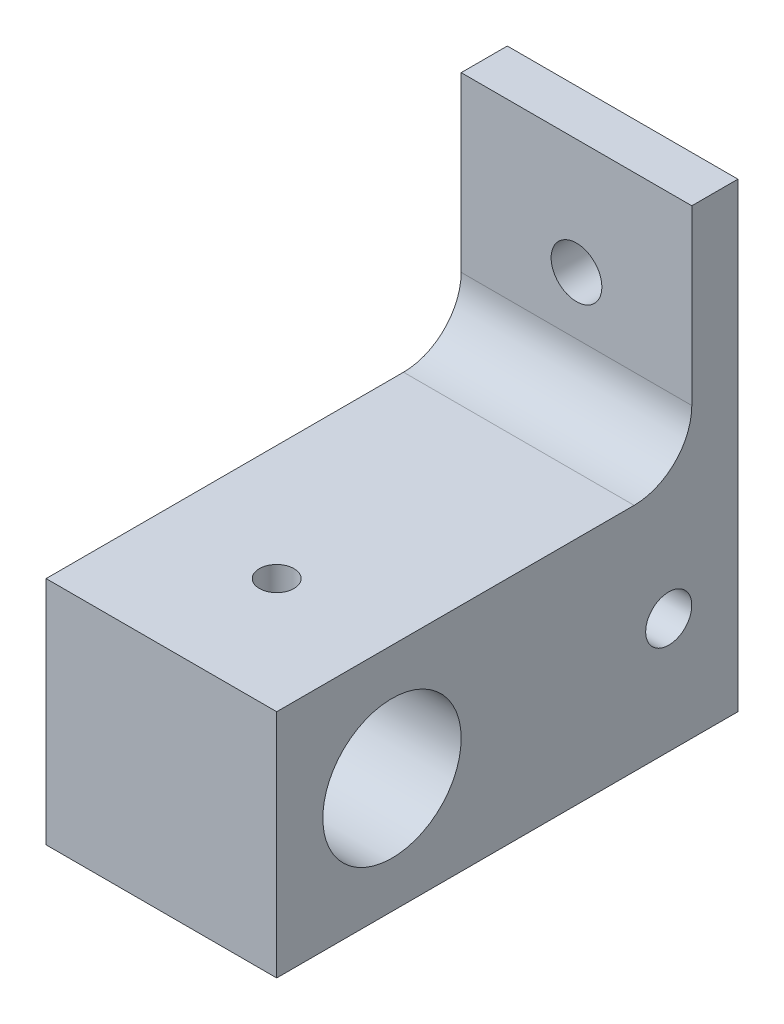
ISO-10303-21;
HEADER;
FILE_DESCRIPTION(('STEP AP214'),'2;1');
FILE_NAME('part.step','',(''),(''),'','','');
FILE_SCHEMA(('AUTOMOTIVE_DESIGN { 1 0 10303 214 1 1 1 1 }'));
ENDSEC;
DATA;
#1=APPLICATION_CONTEXT('core data for automotive mechanical design processes');
#2=APPLICATION_PROTOCOL_DEFINITION('international standard','automotive_design',2000,#1);
#3=PRODUCT_CONTEXT('',#1,'mechanical');
#4=PRODUCT('Part','Part','',(#3));
#5=PRODUCT_RELATED_PRODUCT_CATEGORY('part','',(#4));
#6=PRODUCT_DEFINITION_FORMATION('','',#4);
#7=PRODUCT_DEFINITION_CONTEXT('part definition',#1,'design');
#8=PRODUCT_DEFINITION('design','',#6,#7);
#9=PRODUCT_DEFINITION_SHAPE('','',#8);
#10=(LENGTH_UNIT() NAMED_UNIT(*) SI_UNIT(.MILLI.,.METRE.));
#11=(NAMED_UNIT(*) PLANE_ANGLE_UNIT() SI_UNIT($,.RADIAN.));
#12=(NAMED_UNIT(*) SI_UNIT($,.STERADIAN.) SOLID_ANGLE_UNIT());
#13=UNCERTAINTY_MEASURE_WITH_UNIT(LENGTH_MEASURE(1.E-05),#10,'distance_accuracy_value','');
#14=(GEOMETRIC_REPRESENTATION_CONTEXT(3) GLOBAL_UNCERTAINTY_ASSIGNED_CONTEXT((#13)) GLOBAL_UNIT_ASSIGNED_CONTEXT((#10,
#11,#12)) REPRESENTATION_CONTEXT('',''));
#15=CARTESIAN_POINT('',(0.,0.,0.));
#16=DIRECTION('',(0.,0.,1.));
#17=DIRECTION('',(1.,0.,0.));
#18=AXIS2_PLACEMENT_3D('',#15,#16,#17);
#19=CARTESIAN_POINT('',(0.,20.,40.));
#20=DIRECTION('',(0.,-1.,0.));
#21=DIRECTION('',(0.,0.,-1.));
#22=AXIS2_PLACEMENT_3D('',#19,#20,#21);
#23=PLANE('',#22);
#24=CARTESIAN_POINT('',(10.,20.,30.));
#25=DIRECTION('',(0.,1.,0.));
#26=DIRECTION('',(0.,0.,1.));
#27=AXIS2_PLACEMENT_3D('',#24,#25,#26);
#28=CIRCLE('',#27,1.5);
#29=CARTESIAN_POINT('',(10.,20.,31.5));
#30=VERTEX_POINT('',#29);
#31=EDGE_CURVE('E155',#30,#30,#28,.T.);
#32=ORIENTED_EDGE('',*,*,#31,.F.);
#33=EDGE_LOOP('',(#32));
#34=FACE_BOUND('',#33,.T.);
#35=DIRECTION('',(0.,0.,-1.));
#36=VECTOR('',#35,1.);
#37=CARTESIAN_POINT('',(20.,20.,40.));
#38=LINE('',#37,#36);
#39=CARTESIAN_POINT('',(20.,20.,40.));
#40=VERTEX_POINT('',#39);
#41=CARTESIAN_POINT('',(20.,20.,9.));
#42=VERTEX_POINT('',#41);
#43=EDGE_CURVE('E233',#40,#42,#38,.T.);
#44=ORIENTED_EDGE('',*,*,#43,.T.);
#45=DIRECTION('',(1.,0.,0.));
#46=VECTOR('',#45,1.);
#47=CARTESIAN_POINT('',(0.,20.,9.00000000000001));
#48=LINE('',#47,#46);
#49=CARTESIAN_POINT('',(0.,20.,9.00000000000001));
#50=VERTEX_POINT('',#49);
#51=EDGE_CURVE('E65',#42,#50,#48,.F.);
#52=ORIENTED_EDGE('',*,*,#51,.T.);
#53=DIRECTION('',(0.,0.,-1.));
#54=VECTOR('',#53,1.);
#55=CARTESIAN_POINT('',(0.,20.,40.));
#56=LINE('',#55,#54);
#57=CARTESIAN_POINT('',(0.,20.,40.));
#58=VERTEX_POINT('',#57);
#59=EDGE_CURVE('E230',#58,#50,#56,.T.);
#60=ORIENTED_EDGE('',*,*,#59,.F.);
#61=DIRECTION('',(-1.,0.,0.));
#62=VECTOR('',#61,1.);
#63=CARTESIAN_POINT('',(0.,20.,40.));
#64=LINE('',#63,#62);
#65=EDGE_CURVE('E234',#40,#58,#64,.T.);
#66=ORIENTED_EDGE('',*,*,#65,.F.);
#67=EDGE_LOOP('',(#44,#52,#60,#66));
#68=FACE_BOUND('',#67,.T.);
#69=ADVANCED_FACE('F43',(#34,#68),#23,.F.);
#70=CARTESIAN_POINT('',(0.,0.,40.));
#71=DIRECTION('',(1.,0.,0.));
#72=DIRECTION('',(0.,0.,-1.));
#73=AXIS2_PLACEMENT_3D('',#70,#71,#72);
#74=PLANE('',#73);
#75=CARTESIAN_POINT('',(0.,10.,6.));
#76=DIRECTION('',(-1.,0.,0.));
#77=DIRECTION('',(0.,0.,1.));
#78=AXIS2_PLACEMENT_3D('',#75,#76,#77);
#79=CIRCLE('',#78,2.);
#80=CARTESIAN_POINT('',(0.,10.,8.));
#81=VERTEX_POINT('',#80);
#82=EDGE_CURVE('E150',#81,#81,#79,.T.);
#83=ORIENTED_EDGE('',*,*,#82,.F.);
#84=EDGE_LOOP('',(#83));
#85=FACE_BOUND('',#84,.T.);
#86=CARTESIAN_POINT('',(0.,10.,30.));
#87=DIRECTION('',(1.,0.,0.));
#88=DIRECTION('',(0.,0.,-1.));
#89=AXIS2_PLACEMENT_3D('',#86,#87,#88);
#90=CIRCLE('',#89,6.);
#91=CARTESIAN_POINT('',(0.,10.,24.));
#92=VERTEX_POINT('',#91);
#93=EDGE_CURVE('E226',#92,#92,#90,.T.);
#94=ORIENTED_EDGE('',*,*,#93,.T.);
#95=EDGE_LOOP('',(#94));
#96=FACE_BOUND('',#95,.T.);
#97=DIRECTION('',(0.,-1.,0.));
#98=VECTOR('',#97,1.);
#99=CARTESIAN_POINT('',(0.,0.,0.));
#100=LINE('',#99,#98);
#101=CARTESIAN_POINT('',(0.,40.,0.));
#102=VERTEX_POINT('',#101);
#103=CARTESIAN_POINT('',(0.,0.,0.));
#104=VERTEX_POINT('',#103);
#105=EDGE_CURVE('E120',#102,#104,#100,.T.);
#106=ORIENTED_EDGE('',*,*,#105,.T.);
#107=DIRECTION('',(0.,0.,-1.));
#108=VECTOR('',#107,1.);
#109=CARTESIAN_POINT('',(0.,0.,40.));
#110=LINE('',#109,#108);
#111=CARTESIAN_POINT('',(0.,0.,40.));
#112=VERTEX_POINT('',#111);
#113=EDGE_CURVE('E222',#112,#104,#110,.T.);
#114=ORIENTED_EDGE('',*,*,#113,.F.);
#115=DIRECTION('',(0.,-1.,0.));
#116=VECTOR('',#115,1.);
#117=CARTESIAN_POINT('',(0.,0.,40.));
#118=LINE('',#117,#116);
#119=EDGE_CURVE('E113',#58,#112,#118,.T.);
#120=ORIENTED_EDGE('',*,*,#119,.F.);
#121=ORIENTED_EDGE('',*,*,#59,.T.);
#122=CARTESIAN_POINT('',(0.,25.,9.00000000000001));
#123=DIRECTION('',(1.,0.,0.));
#124=DIRECTION('',(0.,0.,-1.));
#125=AXIS2_PLACEMENT_3D('',#122,#123,#124);
#126=CIRCLE('',#125,5.);
#127=CARTESIAN_POINT('',(0.,25.,4.));
#128=VERTEX_POINT('',#127);
#129=EDGE_CURVE('E11',#50,#128,#126,.T.);
#130=ORIENTED_EDGE('',*,*,#129,.T.);
#131=DIRECTION('',(0.,-1.,0.));
#132=VECTOR('',#131,1.);
#133=CARTESIAN_POINT('',(0.,40.,4.));
#134=LINE('',#133,#132);
#135=CARTESIAN_POINT('',(0.,40.,4.));
#136=VERTEX_POINT('',#135);
#137=EDGE_CURVE('E146',#136,#128,#134,.T.);
#138=ORIENTED_EDGE('',*,*,#137,.F.);
#139=DIRECTION('',(0.,0.,1.));
#140=VECTOR('',#139,1.);
#141=CARTESIAN_POINT('',(0.,40.,0.));
#142=LINE('',#141,#140);
#143=EDGE_CURVE('E124',#102,#136,#142,.T.);
#144=ORIENTED_EDGE('',*,*,#143,.F.);
#145=EDGE_LOOP('',(#106,#114,#120,#121,#130,#138,#144));
#146=FACE_BOUND('',#145,.T.);
#147=ADVANCED_FACE('F198',(#85,#96,#146),#74,.F.);
#148=CARTESIAN_POINT('',(0.,0.,40.));
#149=DIRECTION('',(0.,1.,0.));
#150=DIRECTION('',(0.,0.,1.));
#151=AXIS2_PLACEMENT_3D('',#148,#149,#150);
#152=PLANE('',#151);
#153=DIRECTION('',(1.,0.,0.));
#154=VECTOR('',#153,1.);
#155=CARTESIAN_POINT('',(0.,0.,0.));
#156=LINE('',#155,#154);
#157=CARTESIAN_POINT('',(20.,0.,0.));
#158=VERTEX_POINT('',#157);
#159=EDGE_CURVE('E114',#104,#158,#156,.T.);
#160=ORIENTED_EDGE('',*,*,#159,.T.);
#161=DIRECTION('',(0.,0.,-1.));
#162=VECTOR('',#161,1.);
#163=CARTESIAN_POINT('',(20.,0.,40.));
#164=LINE('',#163,#162);
#165=CARTESIAN_POINT('',(20.,0.,40.));
#166=VERTEX_POINT('',#165);
#167=EDGE_CURVE('E110',#166,#158,#164,.T.);
#168=ORIENTED_EDGE('',*,*,#167,.F.);
#169=DIRECTION('',(1.,0.,0.));
#170=VECTOR('',#169,1.);
#171=CARTESIAN_POINT('',(0.,0.,40.));
#172=LINE('',#171,#170);
#173=EDGE_CURVE('E254',#112,#166,#172,.T.);
#174=ORIENTED_EDGE('',*,*,#173,.F.);
#175=ORIENTED_EDGE('',*,*,#113,.T.);
#176=EDGE_LOOP('',(#160,#168,#174,#175));
#177=FACE_BOUND('',#176,.T.);
#178=ADVANCED_FACE('F205',(#177),#152,.F.);
#179=CARTESIAN_POINT('',(20.,0.,40.));
#180=DIRECTION('',(-1.,0.,0.));
#181=DIRECTION('',(0.,0.,1.));
#182=AXIS2_PLACEMENT_3D('',#179,#180,#181);
#183=PLANE('',#182);
#184=CARTESIAN_POINT('',(20.,10.,6.));
#185=DIRECTION('',(-1.,0.,0.));
#186=DIRECTION('',(0.,0.,1.));
#187=AXIS2_PLACEMENT_3D('',#184,#185,#186);
#188=CIRCLE('',#187,2.);
#189=CARTESIAN_POINT('',(20.,10.,8.));
#190=VERTEX_POINT('',#189);
#191=EDGE_CURVE('E154',#190,#190,#188,.T.);
#192=ORIENTED_EDGE('',*,*,#191,.T.);
#193=EDGE_LOOP('',(#192));
#194=FACE_BOUND('',#193,.T.);
#195=CARTESIAN_POINT('',(20.,10.,30.));
#196=DIRECTION('',(1.,0.,0.));
#197=DIRECTION('',(0.,0.,-1.));
#198=AXIS2_PLACEMENT_3D('',#195,#196,#197);
#199=CIRCLE('',#198,6.);
#200=CARTESIAN_POINT('',(20.,10.,24.));
#201=VERTEX_POINT('',#200);
#202=EDGE_CURVE('E168',#201,#201,#199,.T.);
#203=ORIENTED_EDGE('',*,*,#202,.F.);
#204=EDGE_LOOP('',(#203));
#205=FACE_BOUND('',#204,.T.);
#206=DIRECTION('',(0.,1.,0.));
#207=VECTOR('',#206,1.);
#208=CARTESIAN_POINT('',(20.,0.,0.));
#209=LINE('',#208,#207);
#210=CARTESIAN_POINT('',(20.,40.,0.));
#211=VERTEX_POINT('',#210);
#212=EDGE_CURVE('E103',#158,#211,#209,.T.);
#213=ORIENTED_EDGE('',*,*,#212,.T.);
#214=DIRECTION('',(0.,0.,-1.));
#215=VECTOR('',#214,1.);
#216=CARTESIAN_POINT('',(20.,40.,0.));
#217=LINE('',#216,#215);
#218=CARTESIAN_POINT('',(20.,40.,4.));
#219=VERTEX_POINT('',#218);
#220=EDGE_CURVE('E107',#219,#211,#217,.T.);
#221=ORIENTED_EDGE('',*,*,#220,.F.);
#222=DIRECTION('',(0.,-1.,0.));
#223=VECTOR('',#222,1.);
#224=CARTESIAN_POINT('',(20.,40.,4.));
#225=LINE('',#224,#223);
#226=CARTESIAN_POINT('',(20.,25.,4.));
#227=VERTEX_POINT('',#226);
#228=EDGE_CURVE('E143',#219,#227,#225,.T.);
#229=ORIENTED_EDGE('',*,*,#228,.T.);
#230=CARTESIAN_POINT('',(20.,25.,9.));
#231=DIRECTION('',(-1.,0.,0.));
#232=DIRECTION('',(0.,0.,1.));
#233=AXIS2_PLACEMENT_3D('',#230,#231,#232);
#234=CIRCLE('',#233,5.);
#235=EDGE_CURVE('E52',#227,#42,#234,.T.);
#236=ORIENTED_EDGE('',*,*,#235,.T.);
#237=ORIENTED_EDGE('',*,*,#43,.F.);
#238=DIRECTION('',(0.,1.,0.));
#239=VECTOR('',#238,1.);
#240=CARTESIAN_POINT('',(20.,0.,40.));
#241=LINE('',#240,#239);
#242=EDGE_CURVE('E252',#166,#40,#241,.T.);
#243=ORIENTED_EDGE('',*,*,#242,.F.);
#244=ORIENTED_EDGE('',*,*,#167,.T.);
#245=EDGE_LOOP('',(#213,#221,#229,#236,#237,#243,#244));
#246=FACE_BOUND('',#245,.T.);
#247=ADVANCED_FACE('F105',(#194,#205,#246),#183,.F.);
#248=CARTESIAN_POINT('',(0.,0.,40.));
#249=DIRECTION('',(0.,0.,-1.));
#250=DIRECTION('',(-1.,0.,0.));
#251=AXIS2_PLACEMENT_3D('',#248,#249,#250);
#252=PLANE('',#251);
#253=ORIENTED_EDGE('',*,*,#119,.T.);
#254=ORIENTED_EDGE('',*,*,#173,.T.);
#255=ORIENTED_EDGE('',*,*,#242,.T.);
#256=ORIENTED_EDGE('',*,*,#65,.T.);
#257=EDGE_LOOP('',(#253,#254,#255,#256));
#258=FACE_BOUND('',#257,.T.);
#259=ADVANCED_FACE('F213',(#258),#252,.F.);
#260=CARTESIAN_POINT('',(0.,0.,0.));
#261=DIRECTION('',(0.,0.,-1.));
#262=DIRECTION('',(-1.,0.,0.));
#263=AXIS2_PLACEMENT_3D('',#260,#261,#262);
#264=PLANE('',#263);
#265=CARTESIAN_POINT('',(10.,30.,0.));
#266=DIRECTION('',(0.,0.,-1.));
#267=DIRECTION('',(-1.,0.,0.));
#268=AXIS2_PLACEMENT_3D('',#265,#266,#267);
#269=CIRCLE('',#268,2.2);
#270=CARTESIAN_POINT('',(7.8,30.,0.));
#271=VERTEX_POINT('',#270);
#272=EDGE_CURVE('E131',#271,#271,#269,.T.);
#273=ORIENTED_EDGE('',*,*,#272,.F.);
#274=EDGE_LOOP('',(#273));
#275=FACE_BOUND('',#274,.T.);
#276=ORIENTED_EDGE('',*,*,#105,.F.);
#277=DIRECTION('',(-1.,0.,0.));
#278=VECTOR('',#277,1.);
#279=CARTESIAN_POINT('',(20.,40.,0.));
#280=LINE('',#279,#278);
#281=EDGE_CURVE('E117',#211,#102,#280,.T.);
#282=ORIENTED_EDGE('',*,*,#281,.F.);
#283=ORIENTED_EDGE('',*,*,#212,.F.);
#284=ORIENTED_EDGE('',*,*,#159,.F.);
#285=EDGE_LOOP('',(#276,#282,#283,#284));
#286=FACE_BOUND('',#285,.T.);
#287=ADVANCED_FACE('F118',(#275,#286),#264,.T.);
#288=CARTESIAN_POINT('',(-10.,10.,30.));
#289=DIRECTION('',(1.,0.,0.));
#290=DIRECTION('',(0.,0.,-1.));
#291=AXIS2_PLACEMENT_3D('',#288,#289,#290);
#292=CYLINDRICAL_SURFACE('',#291,6.);
#293=CARTESIAN_POINT('',(10.,15.8094750193111,31.5));
#294=CARTESIAN_POINT('',(10.0828304505548,15.8094766005118,31.4999976471551));
#295=CARTESIAN_POINT('',(10.1656869392068,15.8112658360835,31.4931157472984));
#296=CARTESIAN_POINT('',(10.3290205469044,15.8182111719595,31.4658138752785));
#297=CARTESIAN_POINT('',(10.409496252681,15.8233692317309,31.4453860240453));
#298=CARTESIAN_POINT('',(10.5656821229122,15.8364323475758,31.3916947197792));
#299=CARTESIAN_POINT('',(10.6413982932314,15.8443338561425,31.3584478367127));
#300=CARTESIAN_POINT('',(10.7861865115239,15.8619891521728,31.2801126847568));
#301=CARTESIAN_POINT('',(10.8552582772481,15.871743018271,31.2350239131364));
#302=CARTESIAN_POINT('',(10.9863169871573,15.8922442981337,31.1332250563871));
#303=CARTESIAN_POINT('',(11.04813616021,15.9030075857382,31.0763021326224));
#304=CARTESIAN_POINT('',(11.1614568366162,15.9241772530918,30.9529092384604));
#305=CARTESIAN_POINT('',(11.212957375373,15.9345835993983,30.8864383765082));
#306=CARTESIAN_POINT('',(11.3048652805788,15.9540424931235,30.7446871206474));
#307=CARTESIAN_POINT('',(11.3451078328969,15.9630741244036,30.6692967457171));
#308=CARTESIAN_POINT('',(11.4122857864918,15.9785848715559,30.5125579105757));
#309=CARTESIAN_POINT('',(11.4392231511493,15.9850643640061,30.4312103314752));
#310=CARTESIAN_POINT('',(11.4784887007471,15.9946285530891,30.2666152552525));
#311=CARTESIAN_POINT('',(11.4911017865959,15.9977793630659,30.1834396317294));
#312=CARTESIAN_POINT('',(11.5022550275653,16.0005615646438,30.0160972915577));
#313=CARTESIAN_POINT('',(11.5007972633258,16.0001934765802,29.9319307232772));
#314=CARTESIAN_POINT('',(11.4840550898499,15.9960285697212,29.7669716292414));
#315=CARTESIAN_POINT('',(11.4690782049677,15.9923080140452,29.6861456765984));
#316=CARTESIAN_POINT('',(11.4262172379709,15.9819450191491,29.5281926288795));
#317=CARTESIAN_POINT('',(11.3983324687736,15.9753024243906,29.4510657309444));
#318=CARTESIAN_POINT('',(11.3301984575878,15.9597250582054,29.3018899447473));
#319=CARTESIAN_POINT('',(11.289839773203,15.9507701181703,29.2298932353502));
#320=CARTESIAN_POINT('',(11.1979865925302,15.9315394228579,29.0935865664893));
#321=CARTESIAN_POINT('',(11.1464901588636,15.9212634379149,29.0292779473717));
#322=CARTESIAN_POINT('',(11.0321747548106,15.9001822826171,28.9083389473726));
#323=CARTESIAN_POINT('',(10.9690870645913,15.8893703171555,28.8519634813872));
#324=CARTESIAN_POINT('',(10.8342400158759,15.8686902611002,28.7505354360555));
#325=CARTESIAN_POINT('',(10.7624802523054,15.8588222146358,28.705483385931));
#326=CARTESIAN_POINT('',(10.6118259795106,15.8411229809899,28.6278178064661));
#327=CARTESIAN_POINT('',(10.5328985618121,15.8333019023543,28.5952656495443));
#328=CARTESIAN_POINT('',(10.3704487191541,15.8207118408397,28.5439715690455));
#329=CARTESIAN_POINT('',(10.2869272816101,15.8159422048613,28.5252266901706));
#330=CARTESIAN_POINT('',(10.1200242990861,15.8101321362348,28.5025022168009));
#331=CARTESIAN_POINT('',(10.0366973240022,15.8089965345619,28.4981457156482));
#332=CARTESIAN_POINT('',(9.87050683805311,15.8103240608862,28.5032898056907));
#333=CARTESIAN_POINT('',(9.78764328522926,15.8127868576076,28.5127891212907));
#334=CARTESIAN_POINT('',(9.62613144102718,15.8209424917274,28.5450447216374));
#335=CARTESIAN_POINT('',(9.5474363640575,15.8265818214062,28.567581559031));
#336=CARTESIAN_POINT('',(9.39494112528899,15.8404043096258,28.6250291509976));
#337=CARTESIAN_POINT('',(9.3211415445668,15.8485877694917,28.6599413713725));
#338=CARTESIAN_POINT('',(9.17893523327959,15.8667768225596,28.7419375992381));
#339=CARTESIAN_POINT('',(9.11066269597414,15.8768150116399,28.7892469476986));
#340=CARTESIAN_POINT('',(8.98288698231919,15.8975024984303,28.8944095605983));
#341=CARTESIAN_POINT('',(8.92338525000996,15.9081518963708,28.9522645577918));
#342=CARTESIAN_POINT('',(8.81331337445743,15.9291844181896,29.0786059185229));
#343=CARTESIAN_POINT('',(8.76300396247071,15.939554212371,29.1473220712026));
#344=CARTESIAN_POINT('',(8.67463847982926,15.9585832996824,29.292445975958));
#345=CARTESIAN_POINT('',(8.63658177003508,15.9672426820238,29.3688533265636));
#346=CARTESIAN_POINT('',(8.57413237928324,15.9818206944299,29.5266626974034));
#347=CARTESIAN_POINT('',(8.54964142937257,15.9877589801345,29.6080239284582));
#348=CARTESIAN_POINT('',(8.51472379923495,15.9963117603747,29.7738753595218));
#349=CARTESIAN_POINT('',(8.50429440475657,15.9989268963605,29.8583649524381));
#350=CARTESIAN_POINT('',(8.4979486156367,16.0005125411322,30.025625289665));
#351=CARTESIAN_POINT('',(8.50164743635692,15.9995796832001,30.108380740449));
#352=CARTESIAN_POINT('',(8.5225717409415,15.9943884468614,30.2720512446221));
#353=CARTESIAN_POINT('',(8.53979682251965,15.9901301673564,30.3529663526713));
#354=CARTESIAN_POINT('',(8.58707832965639,15.9787814928094,30.5102565534672));
#355=CARTESIAN_POINT('',(8.61706517997194,15.97170646754,30.5866537418715));
#356=CARTESIAN_POINT('',(8.68895586852899,15.9554693337008,30.7333755795622));
#357=CARTESIAN_POINT('',(8.73086120900435,15.946306962066,30.8036994618976));
#358=CARTESIAN_POINT('',(8.82657285099561,15.92660874522,30.9381028926358));
#359=CARTESIAN_POINT('',(8.88064021436107,15.9160452541842,31.0019924824509));
#360=CARTESIAN_POINT('',(8.9986342779607,15.8948597357986,31.1199225304069));
#361=CARTESIAN_POINT('',(9.06256347414686,15.8842376942883,31.1739604876023));
#362=CARTESIAN_POINT('',(9.199902121302,15.8639121379082,31.2716430397188));
#363=CARTESIAN_POINT('',(9.27346618511894,15.8542294559483,31.3150749291698));
#364=CARTESIAN_POINT('',(9.42708323488405,15.8371593332592,31.3888903449235));
#365=CARTESIAN_POINT('',(9.50713144916011,15.8297702237005,31.4192833646396));
#366=CARTESIAN_POINT('',(9.65586551774007,15.8192786310967,31.4616337928482));
#367=CARTESIAN_POINT('',(9.72383974657579,15.8156299450082,31.4759897558931));
#368=CARTESIAN_POINT('',(9.86120330349994,15.8107275787836,31.4951734388599));
#369=CARTESIAN_POINT('',(9.93059251036759,15.8094736943494,31.5000019715583));
#370=CARTESIAN_POINT('',(10.,15.8094750193111,31.5));
#371=B_SPLINE_CURVE_WITH_KNOTS('',3,(#293,#294,#295,#296,#297,#298,#299,#300,#301,#302,#303,
#304,#305,#306,#307,#308,#309,#310,#311,#312,#313,#314,#315,#316,#317,#318,#319,#320,#321,#322,
#323,#324,#325,#326,#327,#328,#329,#330,#331,#332,#333,#334,#335,#336,#337,#338,#339,#340,#341,
#342,#343,#344,#345,#346,#347,#348,#349,#350,#351,#352,#353,#354,#355,#356,#357,#358,#359,#360,
#361,#362,#363,#364,#365,#366,#367,#368,#369,#370),.UNSPECIFIED.,.T.,.F.,(4,2,2,2,2,2,2,2,2,2,2,
2,2,2,2,2,2,2,2,2,2,2,2,2,2,2,2,2,2,2,2,2,2,2,2,2,2,2,4),(0.,0.248236465041679,
0.496617444857199,0.744678436299608,0.992749960532871,1.24574372515786,1.4987611288792,
1.75530897838751,2.01181895908255,2.26313250597208,2.51440889199612,2.76010957613367,
3.00582334034871,3.25375724552666,3.50173431281347,3.75642279943147,4.01112318719881,
4.26705859205041,4.52293920077728,4.7720614485703,5.0211607631028,5.26618443005523,
5.5112371285285,5.76109707515494,6.01099811331026,6.26715198579191,6.52329249431731,
6.77755243684156,7.03176329345422,7.27910067676473,7.52643070426187,7.77242925935826,
8.01845883442842,8.27038257949241,8.52237018939304,8.77905886370805,9.0355603281997,
9.24358696306397,9.45159585059711),.UNSPECIFIED.);
#372=CARTESIAN_POINT('',(10.,15.8094750193111,31.5));
#373=VERTEX_POINT('',#372);
#374=EDGE_CURVE('E159',#373,#373,#371,.T.);
#375=ORIENTED_EDGE('',*,*,#374,.T.);
#376=EDGE_LOOP('',(#375));
#377=FACE_BOUND('',#376,.T.);
#378=ORIENTED_EDGE('',*,*,#202,.T.);
#379=EDGE_LOOP('',(#378));
#380=FACE_BOUND('',#379,.T.);
#381=ORIENTED_EDGE('',*,*,#93,.F.);
#382=EDGE_LOOP('',(#381));
#383=FACE_BOUND('',#382,.T.);
#384=ADVANCED_FACE('F177',(#377,#380,#383),#292,.F.);
#385=CARTESIAN_POINT('',(10.,20.,30.));
#386=DIRECTION('',(0.,1.,0.));
#387=DIRECTION('',(0.,0.,1.));
#388=AXIS2_PLACEMENT_3D('',#385,#386,#387);
#389=CYLINDRICAL_SURFACE('',#388,1.5);
#390=ORIENTED_EDGE('',*,*,#374,.F.);
#391=EDGE_LOOP('',(#390));
#392=FACE_BOUND('',#391,.T.);
#393=ORIENTED_EDGE('',*,*,#31,.T.);
#394=EDGE_LOOP('',(#393));
#395=FACE_BOUND('',#394,.T.);
#396=ADVANCED_FACE('F172',(#392,#395),#389,.F.);
#397=CARTESIAN_POINT('',(30.,10.,6.));
#398=DIRECTION('',(-1.,0.,0.));
#399=DIRECTION('',(0.,0.,1.));
#400=AXIS2_PLACEMENT_3D('',#397,#398,#399);
#401=CYLINDRICAL_SURFACE('',#400,2.);
#402=ORIENTED_EDGE('',*,*,#82,.T.);
#403=EDGE_LOOP('',(#402));
#404=FACE_BOUND('',#403,.T.);
#405=ORIENTED_EDGE('',*,*,#191,.F.);
#406=EDGE_LOOP('',(#405));
#407=FACE_BOUND('',#406,.T.);
#408=ADVANCED_FACE('F176',(#404,#407),#401,.F.);
#409=CARTESIAN_POINT('',(20.,40.,4.));
#410=DIRECTION('',(0.,0.,-1.));
#411=DIRECTION('',(-1.,0.,0.));
#412=AXIS2_PLACEMENT_3D('',#409,#410,#411);
#413=PLANE('',#412);
#414=CARTESIAN_POINT('',(10.,30.,4.));
#415=DIRECTION('',(0.,0.,1.));
#416=DIRECTION('',(1.,0.,0.));
#417=AXIS2_PLACEMENT_3D('',#414,#415,#416);
#418=CIRCLE('',#417,2.2);
#419=CARTESIAN_POINT('',(12.2,30.,4.));
#420=VERTEX_POINT('',#419);
#421=EDGE_CURVE('E135',#420,#420,#418,.T.);
#422=ORIENTED_EDGE('',*,*,#421,.F.);
#423=EDGE_LOOP('',(#422));
#424=FACE_BOUND('',#423,.T.);
#425=ORIENTED_EDGE('',*,*,#137,.T.);
#426=DIRECTION('',(1.,0.,0.));
#427=VECTOR('',#426,1.);
#428=CARTESIAN_POINT('',(20.,25.,4.));
#429=LINE('',#428,#427);
#430=EDGE_CURVE('E241',#128,#227,#429,.T.);
#431=ORIENTED_EDGE('',*,*,#430,.T.);
#432=ORIENTED_EDGE('',*,*,#228,.F.);
#433=DIRECTION('',(1.,0.,0.));
#434=VECTOR('',#433,1.);
#435=CARTESIAN_POINT('',(20.,40.,4.));
#436=LINE('',#435,#434);
#437=EDGE_CURVE('E128',#136,#219,#436,.T.);
#438=ORIENTED_EDGE('',*,*,#437,.F.);
#439=EDGE_LOOP('',(#425,#431,#432,#438));
#440=FACE_BOUND('',#439,.T.);
#441=ADVANCED_FACE('F181',(#424,#440),#413,.F.);
#442=CARTESIAN_POINT('',(0.,40.,0.));
#443=DIRECTION('',(0.,-1.,0.));
#444=DIRECTION('',(0.,0.,-1.));
#445=AXIS2_PLACEMENT_3D('',#442,#443,#444);
#446=PLANE('',#445);
#447=ORIENTED_EDGE('',*,*,#220,.T.);
#448=ORIENTED_EDGE('',*,*,#281,.T.);
#449=ORIENTED_EDGE('',*,*,#143,.T.);
#450=ORIENTED_EDGE('',*,*,#437,.T.);
#451=EDGE_LOOP('',(#447,#448,#449,#450));
#452=FACE_BOUND('',#451,.T.);
#453=ADVANCED_FACE('F126',(#452),#446,.F.);
#454=CARTESIAN_POINT('',(10.,30.,4.));
#455=DIRECTION('',(0.,0.,1.));
#456=DIRECTION('',(1.,0.,0.));
#457=AXIS2_PLACEMENT_3D('',#454,#455,#456);
#458=CYLINDRICAL_SURFACE('',#457,2.2);
#459=ORIENTED_EDGE('',*,*,#421,.T.);
#460=EDGE_LOOP('',(#459));
#461=FACE_BOUND('',#460,.T.);
#462=ORIENTED_EDGE('',*,*,#272,.T.);
#463=EDGE_LOOP('',(#462));
#464=FACE_BOUND('',#463,.T.);
#465=ADVANCED_FACE('F188',(#461,#464),#458,.F.);
#466=CARTESIAN_POINT('',(20.,25.,9.));
#467=DIRECTION('',(-1.,0.,0.));
#468=DIRECTION('',(0.,0.,1.));
#469=AXIS2_PLACEMENT_3D('',#466,#467,#468);
#470=CYLINDRICAL_SURFACE('',#469,5.);
#471=ORIENTED_EDGE('',*,*,#129,.F.);
#472=ORIENTED_EDGE('',*,*,#51,.F.);
#473=ORIENTED_EDGE('',*,*,#235,.F.);
#474=ORIENTED_EDGE('',*,*,#430,.F.);
#475=EDGE_LOOP('',(#471,#472,#473,#474));
#476=FACE_BOUND('',#475,.T.);
#477=ADVANCED_FACE('F45',(#476),#470,.F.);
#478=CLOSED_SHELL('',(#69,#147,#178,#247,#259,#287,#384,#396,#408,#441,#453,#465,#477));
#479=MANIFOLD_SOLID_BREP('B2',#478);
#480=ADVANCED_BREP_SHAPE_REPRESENTATION('',(#18,#479),#14);
#481=SHAPE_DEFINITION_REPRESENTATION(#9,#480);
ENDSEC;
END-ISO-10303-21;
